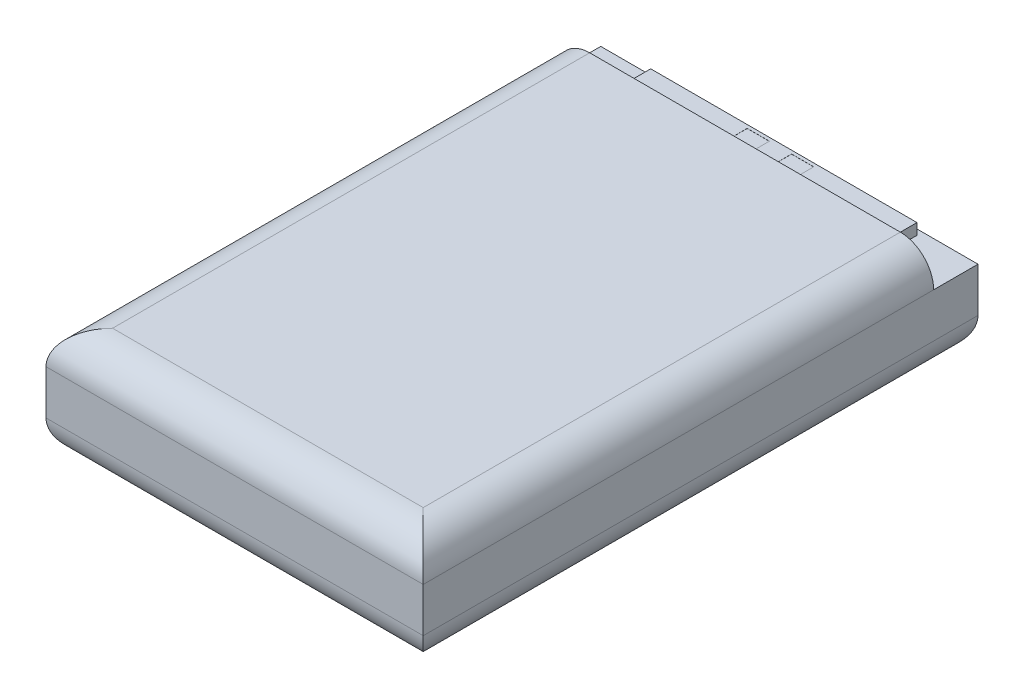
ISO-10303-21;
HEADER;
FILE_DESCRIPTION(('STEP AP214'),'2;1');
FILE_NAME('part.step','',(''),(''),'','','');
FILE_SCHEMA(('AUTOMOTIVE_DESIGN { 1 0 10303 214 1 1 1 1 }'));
ENDSEC;
DATA;
#1=APPLICATION_CONTEXT('core data for automotive mechanical design processes');
#2=APPLICATION_PROTOCOL_DEFINITION('international standard','automotive_design',2000,#1);
#3=PRODUCT_CONTEXT('',#1,'mechanical');
#4=PRODUCT('Part','Part','',(#3));
#5=PRODUCT_RELATED_PRODUCT_CATEGORY('part','',(#4));
#6=PRODUCT_DEFINITION_FORMATION('','',#4);
#7=PRODUCT_DEFINITION_CONTEXT('part definition',#1,'design');
#8=PRODUCT_DEFINITION('design','',#6,#7);
#9=PRODUCT_DEFINITION_SHAPE('','',#8);
#10=(LENGTH_UNIT() NAMED_UNIT(*) SI_UNIT(.MILLI.,.METRE.));
#11=(NAMED_UNIT(*) PLANE_ANGLE_UNIT() SI_UNIT($,.RADIAN.));
#12=(NAMED_UNIT(*) SI_UNIT($,.STERADIAN.) SOLID_ANGLE_UNIT());
#13=UNCERTAINTY_MEASURE_WITH_UNIT(LENGTH_MEASURE(1.E-05),#10,'distance_accuracy_value','');
#14=(GEOMETRIC_REPRESENTATION_CONTEXT(3) GLOBAL_UNCERTAINTY_ASSIGNED_CONTEXT((#13)) GLOBAL_UNIT_ASSIGNED_CONTEXT((#10,
#11,#12)) REPRESENTATION_CONTEXT('',''));
#15=CARTESIAN_POINT('',(0.,0.,0.));
#16=DIRECTION('',(0.,0.,1.));
#17=DIRECTION('',(1.,0.,0.));
#18=AXIS2_PLACEMENT_3D('',#15,#16,#17);
#19=CARTESIAN_POINT('',(0.,7.,0.));
#20=DIRECTION('',(0.,1.,0.));
#21=DIRECTION('',(0.,0.,1.));
#22=AXIS2_PLACEMENT_3D('',#19,#20,#21);
#23=PLANE('',#22);
#24=DIRECTION('',(1.,0.,0.));
#25=VECTOR('',#24,1.);
#26=CARTESIAN_POINT('',(-18.,7.,-21.));
#27=LINE('',#26,#25);
#28=CARTESIAN_POINT('',(-17.,7.,-21.));
#29=VERTEX_POINT('',#28);
#30=CARTESIAN_POINT('',(-12.,7.,-21.));
#31=VERTEX_POINT('',#30);
#32=EDGE_CURVE('E275',#29,#31,#27,.T.);
#33=ORIENTED_EDGE('',*,*,#32,.T.);
#34=DIRECTION('',(0.,0.,1.));
#35=VECTOR('',#34,1.);
#36=CARTESIAN_POINT('',(-12.,7.,-24.5));
#37=LINE('',#36,#35);
#38=CARTESIAN_POINT('',(-12.,7.,-24.5));
#39=VERTEX_POINT('',#38);
#40=EDGE_CURVE('E216',#39,#31,#37,.T.);
#41=ORIENTED_EDGE('',*,*,#40,.F.);
#42=DIRECTION('',(-1.,0.,0.));
#43=VECTOR('',#42,1.);
#44=CARTESIAN_POINT('',(-12.,7.,-24.5));
#45=LINE('',#44,#43);
#46=CARTESIAN_POINT('',(12.,7.,-24.5));
#47=VERTEX_POINT('',#46);
#48=EDGE_CURVE('E253',#47,#39,#45,.T.);
#49=ORIENTED_EDGE('',*,*,#48,.F.);
#50=DIRECTION('',(0.,0.,-1.));
#51=VECTOR('',#50,1.);
#52=CARTESIAN_POINT('',(12.,7.,-24.5));
#53=LINE('',#52,#51);
#54=CARTESIAN_POINT('',(12.,7.,-21.));
#55=VERTEX_POINT('',#54);
#56=EDGE_CURVE('E261',#55,#47,#53,.T.);
#57=ORIENTED_EDGE('',*,*,#56,.F.);
#58=CARTESIAN_POINT('',(17.,7.,-21.));
#59=VERTEX_POINT('',#58);
#60=EDGE_CURVE('E279',#55,#59,#27,.T.);
#61=ORIENTED_EDGE('',*,*,#60,.T.);
#62=DIRECTION('',(0.,0.,-1.));
#63=VECTOR('',#62,1.);
#64=CARTESIAN_POINT('',(17.,7.,25.));
#65=LINE('',#64,#63);
#66=CARTESIAN_POINT('',(17.,7.,-25.));
#67=VERTEX_POINT('',#66);
#68=EDGE_CURVE('E325',#67,#59,#65,.F.);
#69=ORIENTED_EDGE('',*,*,#68,.F.);
#70=DIRECTION('',(-1.,0.,0.));
#71=VECTOR('',#70,1.);
#72=CARTESIAN_POINT('',(17.,7.,-25.));
#73=LINE('',#72,#71);
#74=CARTESIAN_POINT('',(-17.,7.,-25.));
#75=VERTEX_POINT('',#74);
#76=EDGE_CURVE('E278',#67,#75,#73,.T.);
#77=ORIENTED_EDGE('',*,*,#76,.T.);
#78=DIRECTION('',(0.,0.,1.));
#79=VECTOR('',#78,1.);
#80=CARTESIAN_POINT('',(-17.,7.,25.));
#81=LINE('',#80,#79);
#82=EDGE_CURVE('E282',#75,#29,#81,.T.);
#83=ORIENTED_EDGE('',*,*,#82,.T.);
#84=EDGE_LOOP('',(#33,#41,#49,#57,#61,#69,#77,#83));
#85=FACE_BOUND('',#84,.T.);
#86=ADVANCED_FACE('F37',(#85),#23,.T.);
#87=CARTESIAN_POINT('',(-18.,7.,-21.));
#88=DIRECTION('',(0.,0.,1.));
#89=DIRECTION('',(1.,0.,0.));
#90=AXIS2_PLACEMENT_3D('',#87,#88,#89);
#91=PLANE('',#90);
#92=DIRECTION('',(0.,-1.,0.));
#93=VECTOR('',#92,1.);
#94=CARTESIAN_POINT('',(-12.,8.,-21.));
#95=LINE('',#94,#93);
#96=CARTESIAN_POINT('',(-12.,8.,-21.));
#97=VERTEX_POINT('',#96);
#98=EDGE_CURVE('E271',#97,#31,#95,.T.);
#99=ORIENTED_EDGE('',*,*,#98,.T.);
#100=ORIENTED_EDGE('',*,*,#32,.F.);
#101=CARTESIAN_POINT('',(-14.,7.,-21.));
#102=DIRECTION('',(0.,0.,1.));
#103=DIRECTION('',(1.,0.,0.));
#104=AXIS2_PLACEMENT_3D('',#101,#102,#103);
#105=CIRCLE('',#104,3.);
#106=CARTESIAN_POINT('',(-14.,10.,-21.));
#107=VERTEX_POINT('',#106);
#108=EDGE_CURVE('E284',#29,#107,#105,.F.);
#109=ORIENTED_EDGE('',*,*,#108,.T.);
#110=DIRECTION('',(1.,0.,0.));
#111=VECTOR('',#110,1.);
#112=CARTESIAN_POINT('',(-18.,10.,-21.));
#113=LINE('',#112,#111);
#114=CARTESIAN_POINT('',(14.,10.,-21.));
#115=VERTEX_POINT('',#114);
#116=EDGE_CURVE('E274',#107,#115,#113,.T.);
#117=ORIENTED_EDGE('',*,*,#116,.T.);
#118=CARTESIAN_POINT('',(14.,7.,-21.));
#119=DIRECTION('',(0.,0.,1.));
#120=DIRECTION('',(1.,0.,0.));
#121=AXIS2_PLACEMENT_3D('',#118,#119,#120);
#122=CIRCLE('',#121,3.);
#123=EDGE_CURVE('E11',#115,#59,#122,.F.);
#124=ORIENTED_EDGE('',*,*,#123,.T.);
#125=ORIENTED_EDGE('',*,*,#60,.F.);
#126=DIRECTION('',(0.,-1.,0.));
#127=VECTOR('',#126,1.);
#128=CARTESIAN_POINT('',(12.,8.,-21.));
#129=LINE('',#128,#127);
#130=CARTESIAN_POINT('',(12.,8.,-21.));
#131=VERTEX_POINT('',#130);
#132=EDGE_CURVE('E269',#131,#55,#129,.T.);
#133=ORIENTED_EDGE('',*,*,#132,.F.);
#134=DIRECTION('',(1.,0.,0.));
#135=VECTOR('',#134,1.);
#136=CARTESIAN_POINT('',(-12.,8.,-21.));
#137=LINE('',#136,#135);
#138=EDGE_CURVE('E252',#97,#131,#137,.T.);
#139=ORIENTED_EDGE('',*,*,#138,.F.);
#140=EDGE_LOOP('',(#99,#100,#109,#117,#124,#125,#133,#139));
#141=FACE_BOUND('',#140,.T.);
#142=ADVANCED_FACE('F404',(#141),#91,.F.);
#143=CARTESIAN_POINT('',(17.,10.,-25.));
#144=DIRECTION('',(0.,0.,1.));
#145=DIRECTION('',(1.,0.,0.));
#146=AXIS2_PLACEMENT_3D('',#143,#144,#145);
#147=PLANE('',#146);
#148=ORIENTED_EDGE('',*,*,#76,.F.);
#149=DIRECTION('',(0.,-1.,0.));
#150=VECTOR('',#149,1.);
#151=CARTESIAN_POINT('',(17.,10.,-25.));
#152=LINE('',#151,#150);
#153=CARTESIAN_POINT('',(17.,3.,-25.));
#154=VERTEX_POINT('',#153);
#155=EDGE_CURVE('E290',#67,#154,#152,.T.);
#156=ORIENTED_EDGE('',*,*,#155,.T.);
#157=DIRECTION('',(-1.,0.,0.));
#158=VECTOR('',#157,1.);
#159=CARTESIAN_POINT('',(17.,3.,-25.));
#160=LINE('',#159,#158);
#161=CARTESIAN_POINT('',(-17.,3.,-25.));
#162=VERTEX_POINT('',#161);
#163=EDGE_CURVE('E300',#154,#162,#160,.T.);
#164=ORIENTED_EDGE('',*,*,#163,.T.);
#165=DIRECTION('',(0.,-1.,0.));
#166=VECTOR('',#165,1.);
#167=CARTESIAN_POINT('',(-17.,10.,-25.));
#168=LINE('',#167,#166);
#169=EDGE_CURVE('E287',#75,#162,#168,.T.);
#170=ORIENTED_EDGE('',*,*,#169,.F.);
#171=EDGE_LOOP('',(#148,#156,#164,#170));
#172=FACE_BOUND('',#171,.T.);
#173=ADVANCED_FACE('F390',(#172),#147,.F.);
#174=CARTESIAN_POINT('',(-17.,10.,25.));
#175=DIRECTION('',(1.,0.,0.));
#176=DIRECTION('',(0.,0.,-1.));
#177=AXIS2_PLACEMENT_3D('',#174,#175,#176);
#178=PLANE('',#177);
#179=ORIENTED_EDGE('',*,*,#169,.T.);
#180=DIRECTION('',(0.,0.,1.));
#181=VECTOR('',#180,1.);
#182=CARTESIAN_POINT('',(-17.,3.,25.));
#183=LINE('',#182,#181);
#184=CARTESIAN_POINT('',(-17.,3.,25.));
#185=VERTEX_POINT('',#184);
#186=EDGE_CURVE('E45',#162,#185,#183,.T.);
#187=ORIENTED_EDGE('',*,*,#186,.T.);
#188=DIRECTION('',(0.,-1.,0.));
#189=VECTOR('',#188,1.);
#190=CARTESIAN_POINT('',(-17.,10.,25.));
#191=LINE('',#190,#189);
#192=CARTESIAN_POINT('',(-17.,7.,25.));
#193=VERTEX_POINT('',#192);
#194=EDGE_CURVE('E297',#193,#185,#191,.T.);
#195=ORIENTED_EDGE('',*,*,#194,.F.);
#196=DIRECTION('',(0.,0.,1.));
#197=VECTOR('',#196,1.);
#198=CARTESIAN_POINT('',(-17.,7.,-25.));
#199=LINE('',#198,#197);
#200=EDGE_CURVE('E330',#193,#29,#199,.F.);
#201=ORIENTED_EDGE('',*,*,#200,.T.);
#202=ORIENTED_EDGE('',*,*,#82,.F.);
#203=EDGE_LOOP('',(#179,#187,#195,#201,#202));
#204=FACE_BOUND('',#203,.T.);
#205=ADVANCED_FACE('F358',(#204),#178,.F.);
#206=CARTESIAN_POINT('',(17.,10.,25.));
#207=DIRECTION('',(0.,0.,-1.));
#208=DIRECTION('',(-1.,0.,0.));
#209=AXIS2_PLACEMENT_3D('',#206,#207,#208);
#210=PLANE('',#209);
#211=ORIENTED_EDGE('',*,*,#194,.T.);
#212=DIRECTION('',(1.,0.,0.));
#213=VECTOR('',#212,1.);
#214=CARTESIAN_POINT('',(17.,3.,25.));
#215=LINE('',#214,#213);
#216=CARTESIAN_POINT('',(17.,3.,25.));
#217=VERTEX_POINT('',#216);
#218=EDGE_CURVE('E314',#185,#217,#215,.T.);
#219=ORIENTED_EDGE('',*,*,#218,.T.);
#220=DIRECTION('',(0.,-1.,0.));
#221=VECTOR('',#220,1.);
#222=CARTESIAN_POINT('',(17.,10.,25.));
#223=LINE('',#222,#221);
#224=CARTESIAN_POINT('',(17.,7.,25.));
#225=VERTEX_POINT('',#224);
#226=EDGE_CURVE('E294',#225,#217,#223,.T.);
#227=ORIENTED_EDGE('',*,*,#226,.F.);
#228=DIRECTION('',(1.,0.,0.));
#229=VECTOR('',#228,1.);
#230=CARTESIAN_POINT('',(-17.,7.,25.));
#231=LINE('',#230,#229);
#232=EDGE_CURVE('E312',#225,#193,#231,.F.);
#233=ORIENTED_EDGE('',*,*,#232,.T.);
#234=EDGE_LOOP('',(#211,#219,#227,#233));
#235=FACE_BOUND('',#234,.T.);
#236=ADVANCED_FACE('F363',(#235),#210,.F.);
#237=CARTESIAN_POINT('',(17.,10.,25.));
#238=DIRECTION('',(-1.,0.,0.));
#239=DIRECTION('',(0.,0.,1.));
#240=AXIS2_PLACEMENT_3D('',#237,#238,#239);
#241=PLANE('',#240);
#242=ORIENTED_EDGE('',*,*,#226,.T.);
#243=DIRECTION('',(0.,0.,-1.));
#244=VECTOR('',#243,1.);
#245=CARTESIAN_POINT('',(17.,3.,25.));
#246=LINE('',#245,#244);
#247=EDGE_CURVE('E328',#217,#154,#246,.T.);
#248=ORIENTED_EDGE('',*,*,#247,.T.);
#249=ORIENTED_EDGE('',*,*,#155,.F.);
#250=ORIENTED_EDGE('',*,*,#68,.T.);
#251=EDGE_CURVE('E324',#59,#225,#65,.F.);
#252=ORIENTED_EDGE('',*,*,#251,.T.);
#253=EDGE_LOOP('',(#242,#248,#249,#250,#252));
#254=FACE_BOUND('',#253,.T.);
#255=ADVANCED_FACE('F387',(#254),#241,.F.);
#256=CARTESIAN_POINT('',(0.,10.,0.));
#257=DIRECTION('',(0.,1.,0.));
#258=DIRECTION('',(0.,0.,1.));
#259=AXIS2_PLACEMENT_3D('',#256,#257,#258);
#260=PLANE('',#259);
#261=ORIENTED_EDGE('',*,*,#116,.F.);
#262=DIRECTION('',(0.,0.,1.));
#263=VECTOR('',#262,1.);
#264=CARTESIAN_POINT('',(-14.,10.,25.));
#265=LINE('',#264,#263);
#266=CARTESIAN_POINT('',(-14.,10.,22.));
#267=VERTEX_POINT('',#266);
#268=EDGE_CURVE('E316',#107,#267,#265,.T.);
#269=ORIENTED_EDGE('',*,*,#268,.T.);
#270=DIRECTION('',(1.,0.,0.));
#271=VECTOR('',#270,1.);
#272=CARTESIAN_POINT('',(17.,10.,22.));
#273=LINE('',#272,#271);
#274=CARTESIAN_POINT('',(14.,10.,22.));
#275=VERTEX_POINT('',#274);
#276=EDGE_CURVE('E318',#267,#275,#273,.T.);
#277=ORIENTED_EDGE('',*,*,#276,.T.);
#278=DIRECTION('',(0.,0.,-1.));
#279=VECTOR('',#278,1.);
#280=CARTESIAN_POINT('',(14.,10.,-25.));
#281=LINE('',#280,#279);
#282=EDGE_CURVE('E321',#275,#115,#281,.T.);
#283=ORIENTED_EDGE('',*,*,#282,.T.);
#284=EDGE_LOOP('',(#261,#269,#277,#283));
#285=FACE_BOUND('',#284,.T.);
#286=ADVANCED_FACE('F402',(#285),#260,.T.);
#287=CARTESIAN_POINT('',(0.,0.,0.));
#288=DIRECTION('',(0.,1.,0.));
#289=DIRECTION('',(0.,0.,1.));
#290=AXIS2_PLACEMENT_3D('',#287,#288,#289);
#291=PLANE('',#290);
#292=DIRECTION('',(-1.,0.,0.));
#293=VECTOR('',#292,1.);
#294=CARTESIAN_POINT('',(0.,0.,-22.));
#295=LINE('',#294,#293);
#296=CARTESIAN_POINT('',(-14.,0.,-22.));
#297=VERTEX_POINT('',#296);
#298=CARTESIAN_POINT('',(14.,0.,-22.));
#299=VERTEX_POINT('',#298);
#300=EDGE_CURVE('E307',#297,#299,#295,.F.);
#301=ORIENTED_EDGE('',*,*,#300,.T.);
#302=DIRECTION('',(0.,0.,-1.));
#303=VECTOR('',#302,1.);
#304=CARTESIAN_POINT('',(14.,0.,0.));
#305=LINE('',#304,#303);
#306=CARTESIAN_POINT('',(14.,0.,22.));
#307=VERTEX_POINT('',#306);
#308=EDGE_CURVE('E310',#299,#307,#305,.F.);
#309=ORIENTED_EDGE('',*,*,#308,.T.);
#310=DIRECTION('',(1.,0.,0.));
#311=VECTOR('',#310,1.);
#312=CARTESIAN_POINT('',(0.,0.,22.));
#313=LINE('',#312,#311);
#314=CARTESIAN_POINT('',(-14.,0.,22.));
#315=VERTEX_POINT('',#314);
#316=EDGE_CURVE('E305',#307,#315,#313,.F.);
#317=ORIENTED_EDGE('',*,*,#316,.T.);
#318=DIRECTION('',(0.,0.,1.));
#319=VECTOR('',#318,1.);
#320=CARTESIAN_POINT('',(-14.,0.,0.));
#321=LINE('',#320,#319);
#322=EDGE_CURVE('E303',#315,#297,#321,.F.);
#323=ORIENTED_EDGE('',*,*,#322,.T.);
#324=EDGE_LOOP('',(#301,#309,#317,#323));
#325=FACE_BOUND('',#324,.T.);
#326=ADVANCED_FACE('F377',(#325),#291,.F.);
#327=CARTESIAN_POINT('',(17.,3.,22.));
#328=DIRECTION('',(1.,0.,0.));
#329=DIRECTION('',(0.,0.,-1.));
#330=AXIS2_PLACEMENT_3D('',#327,#328,#329);
#331=CYLINDRICAL_SURFACE('',#330,3.);
#332=CARTESIAN_POINT('',(-14.,3.,22.));
#333=DIRECTION('',(0.707106781186548,0.,0.707106781186547));
#334=DIRECTION('',(-0.707106781186547,0.,0.707106781186547));
#335=AXIS2_PLACEMENT_3D('',#332,#333,#334);
#336=ELLIPSE('',#335,4.24264068711929,3.);
#337=EDGE_CURVE('E339',#315,#185,#336,.F.);
#338=ORIENTED_EDGE('',*,*,#337,.F.);
#339=ORIENTED_EDGE('',*,*,#316,.F.);
#340=CARTESIAN_POINT('',(14.,3.,22.));
#341=DIRECTION('',(0.707106781186547,0.,-0.707106781186547));
#342=DIRECTION('',(-0.707106781186548,0.,-0.707106781186547));
#343=AXIS2_PLACEMENT_3D('',#340,#341,#342);
#344=ELLIPSE('',#343,4.24264068711928,3.);
#345=EDGE_CURVE('E291',#217,#307,#344,.T.);
#346=ORIENTED_EDGE('',*,*,#345,.F.);
#347=ORIENTED_EDGE('',*,*,#218,.F.);
#348=EDGE_LOOP('',(#338,#339,#346,#347));
#349=FACE_BOUND('',#348,.T.);
#350=ADVANCED_FACE('F368',(#349),#331,.T.);
#351=CARTESIAN_POINT('',(14.,3.,25.));
#352=DIRECTION('',(0.,0.,-1.));
#353=DIRECTION('',(-1.,0.,0.));
#354=AXIS2_PLACEMENT_3D('',#351,#352,#353);
#355=CYLINDRICAL_SURFACE('',#354,3.);
#356=ORIENTED_EDGE('',*,*,#345,.T.);
#357=ORIENTED_EDGE('',*,*,#308,.F.);
#358=CARTESIAN_POINT('',(14.,3.,-22.));
#359=DIRECTION('',(-0.707106781186548,0.,-0.707106781186547));
#360=DIRECTION('',(0.707106781186547,0.,-0.707106781186548));
#361=AXIS2_PLACEMENT_3D('',#358,#359,#360);
#362=ELLIPSE('',#361,4.24264068711929,3.);
#363=EDGE_CURVE('E336',#154,#299,#362,.T.);
#364=ORIENTED_EDGE('',*,*,#363,.F.);
#365=ORIENTED_EDGE('',*,*,#247,.F.);
#366=EDGE_LOOP('',(#356,#357,#364,#365));
#367=FACE_BOUND('',#366,.T.);
#368=ADVANCED_FACE('F384',(#367),#355,.T.);
#369=CARTESIAN_POINT('',(-14.,3.,25.));
#370=DIRECTION('',(0.,0.,1.));
#371=DIRECTION('',(1.,0.,0.));
#372=AXIS2_PLACEMENT_3D('',#369,#370,#371);
#373=CYLINDRICAL_SURFACE('',#372,3.);
#374=ORIENTED_EDGE('',*,*,#337,.T.);
#375=ORIENTED_EDGE('',*,*,#186,.F.);
#376=CARTESIAN_POINT('',(-14.,3.,-22.));
#377=DIRECTION('',(-0.707106781186547,0.,0.707106781186548));
#378=DIRECTION('',(0.707106781186548,0.,0.707106781186547));
#379=AXIS2_PLACEMENT_3D('',#376,#377,#378);
#380=ELLIPSE('',#379,4.24264068711928,3.);
#381=EDGE_CURVE('E334',#297,#162,#380,.F.);
#382=ORIENTED_EDGE('',*,*,#381,.F.);
#383=ORIENTED_EDGE('',*,*,#322,.F.);
#384=EDGE_LOOP('',(#374,#375,#382,#383));
#385=FACE_BOUND('',#384,.T.);
#386=ADVANCED_FACE('F373',(#385),#373,.T.);
#387=CARTESIAN_POINT('',(17.,3.,-22.));
#388=DIRECTION('',(-1.,0.,0.));
#389=DIRECTION('',(0.,0.,1.));
#390=AXIS2_PLACEMENT_3D('',#387,#388,#389);
#391=CYLINDRICAL_SURFACE('',#390,3.);
#392=ORIENTED_EDGE('',*,*,#363,.T.);
#393=ORIENTED_EDGE('',*,*,#300,.F.);
#394=ORIENTED_EDGE('',*,*,#381,.T.);
#395=ORIENTED_EDGE('',*,*,#163,.F.);
#396=EDGE_LOOP('',(#392,#393,#394,#395));
#397=FACE_BOUND('',#396,.T.);
#398=ADVANCED_FACE('F379',(#397),#391,.T.);
#399=CARTESIAN_POINT('',(-14.,7.,0.));
#400=DIRECTION('',(0.,0.,-1.));
#401=DIRECTION('',(-1.,0.,0.));
#402=AXIS2_PLACEMENT_3D('',#399,#400,#401);
#403=CYLINDRICAL_SURFACE('',#402,3.);
#404=ORIENTED_EDGE('',*,*,#108,.F.);
#405=ORIENTED_EDGE('',*,*,#200,.F.);
#406=CARTESIAN_POINT('',(-14.,7.,22.));
#407=DIRECTION('',(-0.707106781186548,0.,-0.707106781186547));
#408=DIRECTION('',(0.707106781186547,0.,-0.707106781186547));
#409=AXIS2_PLACEMENT_3D('',#406,#407,#408);
#410=ELLIPSE('',#409,4.24264068711929,3.);
#411=EDGE_CURVE('E337',#267,#193,#410,.F.);
#412=ORIENTED_EDGE('',*,*,#411,.F.);
#413=ORIENTED_EDGE('',*,*,#268,.F.);
#414=EDGE_LOOP('',(#404,#405,#412,#413));
#415=FACE_BOUND('',#414,.T.);
#416=ADVANCED_FACE('F39',(#415),#403,.T.);
#417=CARTESIAN_POINT('',(14.,7.,0.));
#418=DIRECTION('',(0.,0.,1.));
#419=DIRECTION('',(1.,0.,0.));
#420=AXIS2_PLACEMENT_3D('',#417,#418,#419);
#421=CYLINDRICAL_SURFACE('',#420,3.);
#422=ORIENTED_EDGE('',*,*,#123,.F.);
#423=ORIENTED_EDGE('',*,*,#282,.F.);
#424=CARTESIAN_POINT('',(14.,7.,22.));
#425=DIRECTION('',(-0.707106781186547,0.,0.707106781186547));
#426=DIRECTION('',(0.707106781186548,0.,0.707106781186547));
#427=AXIS2_PLACEMENT_3D('',#424,#425,#426);
#428=ELLIPSE('',#427,4.24264068711928,3.);
#429=EDGE_CURVE('E286',#225,#275,#428,.T.);
#430=ORIENTED_EDGE('',*,*,#429,.F.);
#431=ORIENTED_EDGE('',*,*,#251,.F.);
#432=EDGE_LOOP('',(#422,#423,#430,#431));
#433=FACE_BOUND('',#432,.T.);
#434=ADVANCED_FACE('F398',(#433),#421,.T.);
#435=CARTESIAN_POINT('',(0.,7.,22.));
#436=DIRECTION('',(-1.,0.,0.));
#437=DIRECTION('',(0.,0.,1.));
#438=AXIS2_PLACEMENT_3D('',#435,#436,#437);
#439=CYLINDRICAL_SURFACE('',#438,3.);
#440=ORIENTED_EDGE('',*,*,#411,.T.);
#441=ORIENTED_EDGE('',*,*,#232,.F.);
#442=ORIENTED_EDGE('',*,*,#429,.T.);
#443=ORIENTED_EDGE('',*,*,#276,.F.);
#444=EDGE_LOOP('',(#440,#441,#442,#443));
#445=FACE_BOUND('',#444,.T.);
#446=ADVANCED_FACE('F349',(#445),#439,.T.);
#447=CARTESIAN_POINT('',(-12.,8.,-24.5));
#448=DIRECTION('',(1.,0.,0.));
#449=DIRECTION('',(0.,0.,-1.));
#450=AXIS2_PLACEMENT_3D('',#447,#448,#449);
#451=PLANE('',#450);
#452=ORIENTED_EDGE('',*,*,#40,.T.);
#453=ORIENTED_EDGE('',*,*,#98,.F.);
#454=DIRECTION('',(0.,0.,1.));
#455=VECTOR('',#454,1.);
#456=CARTESIAN_POINT('',(-12.,8.,-24.5));
#457=LINE('',#456,#455);
#458=CARTESIAN_POINT('',(-12.,8.,-24.5));
#459=VERTEX_POINT('',#458);
#460=EDGE_CURVE('E249',#459,#97,#457,.T.);
#461=ORIENTED_EDGE('',*,*,#460,.F.);
#462=DIRECTION('',(0.,-1.,0.));
#463=VECTOR('',#462,1.);
#464=CARTESIAN_POINT('',(-12.,8.,-24.5));
#465=LINE('',#464,#463);
#466=EDGE_CURVE('E259',#459,#39,#465,.T.);
#467=ORIENTED_EDGE('',*,*,#466,.T.);
#468=EDGE_LOOP('',(#452,#453,#461,#467));
#469=FACE_BOUND('',#468,.T.);
#470=ADVANCED_FACE('F409',(#469),#451,.F.);
#471=CARTESIAN_POINT('',(12.,8.,-24.5));
#472=DIRECTION('',(-1.,0.,0.));
#473=DIRECTION('',(0.,0.,1.));
#474=AXIS2_PLACEMENT_3D('',#471,#472,#473);
#475=PLANE('',#474);
#476=ORIENTED_EDGE('',*,*,#56,.T.);
#477=DIRECTION('',(0.,-1.,0.));
#478=VECTOR('',#477,1.);
#479=CARTESIAN_POINT('',(12.,8.,-24.5));
#480=LINE('',#479,#478);
#481=CARTESIAN_POINT('',(12.,8.,-24.5));
#482=VERTEX_POINT('',#481);
#483=EDGE_CURVE('E266',#482,#47,#480,.T.);
#484=ORIENTED_EDGE('',*,*,#483,.F.);
#485=DIRECTION('',(0.,0.,-1.));
#486=VECTOR('',#485,1.);
#487=CARTESIAN_POINT('',(12.,8.,-24.5));
#488=LINE('',#487,#486);
#489=EDGE_CURVE('E255',#131,#482,#488,.T.);
#490=ORIENTED_EDGE('',*,*,#489,.F.);
#491=ORIENTED_EDGE('',*,*,#132,.T.);
#492=EDGE_LOOP('',(#476,#484,#490,#491));
#493=FACE_BOUND('',#492,.T.);
#494=ADVANCED_FACE('F418',(#493),#475,.F.);
#495=CARTESIAN_POINT('',(-12.,8.,-24.5));
#496=DIRECTION('',(0.,0.,1.));
#497=DIRECTION('',(1.,0.,0.));
#498=AXIS2_PLACEMENT_3D('',#495,#496,#497);
#499=PLANE('',#498);
#500=ORIENTED_EDGE('',*,*,#48,.T.);
#501=ORIENTED_EDGE('',*,*,#466,.F.);
#502=DIRECTION('',(-1.,0.,0.));
#503=VECTOR('',#502,1.);
#504=CARTESIAN_POINT('',(-12.,8.,-24.5));
#505=LINE('',#504,#503);
#506=EDGE_CURVE('E257',#482,#459,#505,.T.);
#507=ORIENTED_EDGE('',*,*,#506,.F.);
#508=ORIENTED_EDGE('',*,*,#483,.T.);
#509=EDGE_LOOP('',(#500,#501,#507,#508));
#510=FACE_BOUND('',#509,.T.);
#511=ADVANCED_FACE('F414',(#510),#499,.F.);
#512=CARTESIAN_POINT('',(0.,8.,0.));
#513=DIRECTION('',(0.,1.,0.));
#514=DIRECTION('',(0.,0.,1.));
#515=AXIS2_PLACEMENT_3D('',#512,#513,#514);
#516=PLANE('',#515);
#517=DIRECTION('',(0.,0.,1.));
#518=VECTOR('',#517,1.);
#519=CARTESIAN_POINT('',(-3.,8.,-24.2));
#520=LINE('',#519,#518);
#521=CARTESIAN_POINT('',(-3.,8.,-24.2));
#522=VERTEX_POINT('',#521);
#523=CARTESIAN_POINT('',(-3.,8.,-21.3));
#524=VERTEX_POINT('',#523);
#525=EDGE_CURVE('E52',#522,#524,#520,.T.);
#526=ORIENTED_EDGE('',*,*,#525,.F.);
#527=DIRECTION('',(-1.,0.,0.));
#528=VECTOR('',#527,1.);
#529=CARTESIAN_POINT('',(-3.,8.,-24.2));
#530=LINE('',#529,#528);
#531=CARTESIAN_POINT('',(-1.,8.,-24.2));
#532=VERTEX_POINT('',#531);
#533=EDGE_CURVE('E200',#532,#522,#530,.T.);
#534=ORIENTED_EDGE('',*,*,#533,.F.);
#535=DIRECTION('',(0.,0.,-1.));
#536=VECTOR('',#535,1.);
#537=CARTESIAN_POINT('',(-1.,8.,-24.2));
#538=LINE('',#537,#536);
#539=CARTESIAN_POINT('',(-1.,8.,-21.3));
#540=VERTEX_POINT('',#539);
#541=EDGE_CURVE('E203',#540,#532,#538,.T.);
#542=ORIENTED_EDGE('',*,*,#541,.F.);
#543=DIRECTION('',(1.,0.,0.));
#544=VECTOR('',#543,1.);
#545=CARTESIAN_POINT('',(-3.,8.,-21.3));
#546=LINE('',#545,#544);
#547=EDGE_CURVE('E209',#524,#540,#546,.T.);
#548=ORIENTED_EDGE('',*,*,#547,.F.);
#549=EDGE_LOOP('',(#526,#534,#542,#548));
#550=FACE_BOUND('',#549,.T.);
#551=DIRECTION('',(0.,0.,1.));
#552=VECTOR('',#551,1.);
#553=CARTESIAN_POINT('',(0.999999999999997,8.,-24.2));
#554=LINE('',#553,#552);
#555=CARTESIAN_POINT('',(0.999999999999997,8.,-24.2));
#556=VERTEX_POINT('',#555);
#557=CARTESIAN_POINT('',(0.999999999999997,8.,-21.3));
#558=VERTEX_POINT('',#557);
#559=EDGE_CURVE('E60',#556,#558,#554,.T.);
#560=ORIENTED_EDGE('',*,*,#559,.F.);
#561=DIRECTION('',(-1.,0.,0.));
#562=VECTOR('',#561,1.);
#563=CARTESIAN_POINT('',(0.999999999999997,8.,-24.2));
#564=LINE('',#563,#562);
#565=CARTESIAN_POINT('',(3.,8.,-24.2));
#566=VERTEX_POINT('',#565);
#567=EDGE_CURVE('E224',#566,#556,#564,.T.);
#568=ORIENTED_EDGE('',*,*,#567,.F.);
#569=DIRECTION('',(0.,0.,-1.));
#570=VECTOR('',#569,1.);
#571=CARTESIAN_POINT('',(3.,8.,-24.2));
#572=LINE('',#571,#570);
#573=CARTESIAN_POINT('',(3.,8.,-21.3));
#574=VERTEX_POINT('',#573);
#575=EDGE_CURVE('E238',#574,#566,#572,.T.);
#576=ORIENTED_EDGE('',*,*,#575,.F.);
#577=DIRECTION('',(1.,0.,0.));
#578=VECTOR('',#577,1.);
#579=CARTESIAN_POINT('',(0.999999999999997,8.,-21.3));
#580=LINE('',#579,#578);
#581=EDGE_CURVE('E235',#558,#574,#580,.T.);
#582=ORIENTED_EDGE('',*,*,#581,.F.);
#583=EDGE_LOOP('',(#560,#568,#576,#582));
#584=FACE_BOUND('',#583,.T.);
#585=ORIENTED_EDGE('',*,*,#460,.T.);
#586=ORIENTED_EDGE('',*,*,#138,.T.);
#587=ORIENTED_EDGE('',*,*,#489,.T.);
#588=ORIENTED_EDGE('',*,*,#506,.T.);
#589=EDGE_LOOP('',(#585,#586,#587,#588));
#590=FACE_BOUND('',#589,.T.);
#591=ADVANCED_FACE('F421',(#550,#584,#590),#516,.T.);
#592=CARTESIAN_POINT('',(0.999999999999997,7.99,-24.2));
#593=DIRECTION('',(-1.,0.,0.));
#594=DIRECTION('',(0.,0.,1.));
#595=AXIS2_PLACEMENT_3D('',#592,#593,#594);
#596=PLANE('',#595);
#597=ORIENTED_EDGE('',*,*,#559,.T.);
#598=DIRECTION('',(0.,1.,0.));
#599=VECTOR('',#598,1.);
#600=CARTESIAN_POINT('',(0.999999999999997,7.99,-21.3));
#601=LINE('',#600,#599);
#602=CARTESIAN_POINT('',(0.999999999999997,7.99,-21.3));
#603=VERTEX_POINT('',#602);
#604=EDGE_CURVE('E233',#603,#558,#601,.T.);
#605=ORIENTED_EDGE('',*,*,#604,.F.);
#606=DIRECTION('',(0.,0.,1.));
#607=VECTOR('',#606,1.);
#608=CARTESIAN_POINT('',(0.999999999999997,7.99,-24.2));
#609=LINE('',#608,#607);
#610=CARTESIAN_POINT('',(0.999999999999997,7.99,-24.2));
#611=VERTEX_POINT('',#610);
#612=EDGE_CURVE('E220',#611,#603,#609,.T.);
#613=ORIENTED_EDGE('',*,*,#612,.F.);
#614=DIRECTION('',(0.,1.,0.));
#615=VECTOR('',#614,1.);
#616=CARTESIAN_POINT('',(0.999999999999997,7.99,-24.2));
#617=LINE('',#616,#615);
#618=EDGE_CURVE('E210',#611,#556,#617,.T.);
#619=ORIENTED_EDGE('',*,*,#618,.T.);
#620=EDGE_LOOP('',(#597,#605,#613,#619));
#621=FACE_BOUND('',#620,.T.);
#622=ADVANCED_FACE('F423',(#621),#596,.F.);
#623=CARTESIAN_POINT('',(0.999999999999997,7.99,-24.2));
#624=DIRECTION('',(0.,0.,-1.));
#625=DIRECTION('',(-1.,0.,0.));
#626=AXIS2_PLACEMENT_3D('',#623,#624,#625);
#627=PLANE('',#626);
#628=ORIENTED_EDGE('',*,*,#567,.T.);
#629=ORIENTED_EDGE('',*,*,#618,.F.);
#630=DIRECTION('',(-1.,0.,0.));
#631=VECTOR('',#630,1.);
#632=CARTESIAN_POINT('',(0.999999999999997,7.99,-24.2));
#633=LINE('',#632,#631);
#634=CARTESIAN_POINT('',(3.,7.99,-24.2));
#635=VERTEX_POINT('',#634);
#636=EDGE_CURVE('E230',#635,#611,#633,.T.);
#637=ORIENTED_EDGE('',*,*,#636,.F.);
#638=DIRECTION('',(0.,1.,0.));
#639=VECTOR('',#638,1.);
#640=CARTESIAN_POINT('',(3.,7.99,-24.2));
#641=LINE('',#640,#639);
#642=EDGE_CURVE('E244',#635,#566,#641,.T.);
#643=ORIENTED_EDGE('',*,*,#642,.T.);
#644=EDGE_LOOP('',(#628,#629,#637,#643));
#645=FACE_BOUND('',#644,.T.);
#646=ADVANCED_FACE('F430',(#645),#627,.F.);
#647=CARTESIAN_POINT('',(3.,7.99,-24.2));
#648=DIRECTION('',(1.,0.,0.));
#649=DIRECTION('',(0.,0.,-1.));
#650=AXIS2_PLACEMENT_3D('',#647,#648,#649);
#651=PLANE('',#650);
#652=ORIENTED_EDGE('',*,*,#575,.T.);
#653=ORIENTED_EDGE('',*,*,#642,.F.);
#654=DIRECTION('',(0.,0.,-1.));
#655=VECTOR('',#654,1.);
#656=CARTESIAN_POINT('',(3.,7.99,-24.2));
#657=LINE('',#656,#655);
#658=CARTESIAN_POINT('',(3.,7.99,-21.3));
#659=VERTEX_POINT('',#658);
#660=EDGE_CURVE('E227',#659,#635,#657,.T.);
#661=ORIENTED_EDGE('',*,*,#660,.F.);
#662=DIRECTION('',(0.,1.,0.));
#663=VECTOR('',#662,1.);
#664=CARTESIAN_POINT('',(3.,7.99,-21.3));
#665=LINE('',#664,#663);
#666=EDGE_CURVE('E246',#659,#574,#665,.T.);
#667=ORIENTED_EDGE('',*,*,#666,.T.);
#668=EDGE_LOOP('',(#652,#653,#661,#667));
#669=FACE_BOUND('',#668,.T.);
#670=ADVANCED_FACE('F556',(#669),#651,.F.);
#671=CARTESIAN_POINT('',(0.999999999999997,7.99,-21.3));
#672=DIRECTION('',(0.,0.,1.));
#673=DIRECTION('',(1.,0.,0.));
#674=AXIS2_PLACEMENT_3D('',#671,#672,#673);
#675=PLANE('',#674);
#676=ORIENTED_EDGE('',*,*,#581,.T.);
#677=ORIENTED_EDGE('',*,*,#666,.F.);
#678=DIRECTION('',(1.,0.,0.));
#679=VECTOR('',#678,1.);
#680=CARTESIAN_POINT('',(0.999999999999997,7.99,-21.3));
#681=LINE('',#680,#679);
#682=EDGE_CURVE('E223',#603,#659,#681,.T.);
#683=ORIENTED_EDGE('',*,*,#682,.F.);
#684=ORIENTED_EDGE('',*,*,#604,.T.);
#685=EDGE_LOOP('',(#676,#677,#683,#684));
#686=FACE_BOUND('',#685,.T.);
#687=ADVANCED_FACE('F566',(#686),#675,.F.);
#688=CARTESIAN_POINT('',(0.,7.99,0.));
#689=DIRECTION('',(0.,1.,0.));
#690=DIRECTION('',(0.,0.,1.));
#691=AXIS2_PLACEMENT_3D('',#688,#689,#690);
#692=PLANE('',#691);
#693=ORIENTED_EDGE('',*,*,#612,.T.);
#694=ORIENTED_EDGE('',*,*,#682,.T.);
#695=ORIENTED_EDGE('',*,*,#660,.T.);
#696=ORIENTED_EDGE('',*,*,#636,.T.);
#697=EDGE_LOOP('',(#693,#694,#695,#696));
#698=FACE_BOUND('',#697,.T.);
#699=ADVANCED_FACE('F576',(#698),#692,.T.);
#700=CARTESIAN_POINT('',(-3.,7.99,-24.2));
#701=DIRECTION('',(-1.,0.,0.));
#702=DIRECTION('',(0.,0.,1.));
#703=AXIS2_PLACEMENT_3D('',#700,#701,#702);
#704=PLANE('',#703);
#705=ORIENTED_EDGE('',*,*,#525,.T.);
#706=DIRECTION('',(0.,1.,0.));
#707=VECTOR('',#706,1.);
#708=CARTESIAN_POINT('',(-3.,7.99,-21.3));
#709=LINE('',#708,#707);
#710=CARTESIAN_POINT('',(-3.,7.99,-21.3));
#711=VERTEX_POINT('',#710);
#712=EDGE_CURVE('E178',#711,#524,#709,.T.);
#713=ORIENTED_EDGE('',*,*,#712,.F.);
#714=DIRECTION('',(0.,0.,1.));
#715=VECTOR('',#714,1.);
#716=CARTESIAN_POINT('',(-3.,7.99,-24.2));
#717=LINE('',#716,#715);
#718=CARTESIAN_POINT('',(-3.,7.99,-24.2));
#719=VERTEX_POINT('',#718);
#720=EDGE_CURVE('E182',#719,#711,#717,.T.);
#721=ORIENTED_EDGE('',*,*,#720,.F.);
#722=DIRECTION('',(0.,1.,0.));
#723=VECTOR('',#722,1.);
#724=CARTESIAN_POINT('',(-3.,7.99,-24.2));
#725=LINE('',#724,#723);
#726=EDGE_CURVE('E214',#719,#522,#725,.T.);
#727=ORIENTED_EDGE('',*,*,#726,.T.);
#728=EDGE_LOOP('',(#705,#713,#721,#727));
#729=FACE_BOUND('',#728,.T.);
#730=ADVANCED_FACE('F180',(#729),#704,.F.);
#731=CARTESIAN_POINT('',(-3.,7.99,-24.2));
#732=DIRECTION('',(0.,0.,-1.));
#733=DIRECTION('',(-1.,0.,0.));
#734=AXIS2_PLACEMENT_3D('',#731,#732,#733);
#735=PLANE('',#734);
#736=ORIENTED_EDGE('',*,*,#533,.T.);
#737=ORIENTED_EDGE('',*,*,#726,.F.);
#738=DIRECTION('',(-1.,0.,0.));
#739=VECTOR('',#738,1.);
#740=CARTESIAN_POINT('',(-3.,7.99,-24.2));
#741=LINE('',#740,#739);
#742=CARTESIAN_POINT('',(-1.,7.99,-24.2));
#743=VERTEX_POINT('',#742);
#744=EDGE_CURVE('E188',#743,#719,#741,.T.);
#745=ORIENTED_EDGE('',*,*,#744,.F.);
#746=DIRECTION('',(0.,1.,0.));
#747=VECTOR('',#746,1.);
#748=CARTESIAN_POINT('',(-1.,7.99,-24.2));
#749=LINE('',#748,#747);
#750=EDGE_CURVE('E217',#743,#532,#749,.T.);
#751=ORIENTED_EDGE('',*,*,#750,.T.);
#752=EDGE_LOOP('',(#736,#737,#745,#751));
#753=FACE_BOUND('',#752,.T.);
#754=ADVANCED_FACE('F595',(#753),#735,.F.);
#755=CARTESIAN_POINT('',(-1.,7.99,-24.2));
#756=DIRECTION('',(1.,0.,0.));
#757=DIRECTION('',(0.,0.,-1.));
#758=AXIS2_PLACEMENT_3D('',#755,#756,#757);
#759=PLANE('',#758);
#760=ORIENTED_EDGE('',*,*,#541,.T.);
#761=ORIENTED_EDGE('',*,*,#750,.F.);
#762=DIRECTION('',(0.,0.,-1.));
#763=VECTOR('',#762,1.);
#764=CARTESIAN_POINT('',(-1.,7.99,-24.2));
#765=LINE('',#764,#763);
#766=CARTESIAN_POINT('',(-1.,7.99,-21.3));
#767=VERTEX_POINT('',#766);
#768=EDGE_CURVE('E196',#767,#743,#765,.T.);
#769=ORIENTED_EDGE('',*,*,#768,.F.);
#770=DIRECTION('',(0.,1.,0.));
#771=VECTOR('',#770,1.);
#772=CARTESIAN_POINT('',(-1.,7.99,-21.3));
#773=LINE('',#772,#771);
#774=EDGE_CURVE('E187',#767,#540,#773,.T.);
#775=ORIENTED_EDGE('',*,*,#774,.T.);
#776=EDGE_LOOP('',(#760,#761,#769,#775));
#777=FACE_BOUND('',#776,.T.);
#778=ADVANCED_FACE('F604',(#777),#759,.F.);
#779=CARTESIAN_POINT('',(-3.,7.99,-21.3));
#780=DIRECTION('',(0.,0.,1.));
#781=DIRECTION('',(1.,0.,0.));
#782=AXIS2_PLACEMENT_3D('',#779,#780,#781);
#783=PLANE('',#782);
#784=ORIENTED_EDGE('',*,*,#547,.T.);
#785=ORIENTED_EDGE('',*,*,#774,.F.);
#786=DIRECTION('',(1.,0.,0.));
#787=VECTOR('',#786,1.);
#788=CARTESIAN_POINT('',(-3.,7.99,-21.3));
#789=LINE('',#788,#787);
#790=EDGE_CURVE('E191',#711,#767,#789,.T.);
#791=ORIENTED_EDGE('',*,*,#790,.F.);
#792=ORIENTED_EDGE('',*,*,#712,.T.);
#793=EDGE_LOOP('',(#784,#785,#791,#792));
#794=FACE_BOUND('',#793,.T.);
#795=ADVANCED_FACE('F192',(#794),#783,.F.);
#796=CARTESIAN_POINT('',(0.,7.99,0.));
#797=DIRECTION('',(0.,1.,0.));
#798=DIRECTION('',(0.,0.,1.));
#799=AXIS2_PLACEMENT_3D('',#796,#797,#798);
#800=PLANE('',#799);
#801=ORIENTED_EDGE('',*,*,#720,.T.);
#802=ORIENTED_EDGE('',*,*,#790,.T.);
#803=ORIENTED_EDGE('',*,*,#768,.T.);
#804=ORIENTED_EDGE('',*,*,#744,.T.);
#805=EDGE_LOOP('',(#801,#802,#803,#804));
#806=FACE_BOUND('',#805,.T.);
#807=ADVANCED_FACE('F198',(#806),#800,.T.);
#808=CLOSED_SHELL('',(#86,#142,#173,#205,#236,#255,#286,#326,#350,#368,#386,#398,#416,#434,#446,
#470,#494,#511,#591,#622,#646,#670,#687,#699,#730,#754,#778,#795,#807));
#809=MANIFOLD_SOLID_BREP('B2',#808);
#810=ADVANCED_BREP_SHAPE_REPRESENTATION('',(#18,#809),#14);
#811=SHAPE_DEFINITION_REPRESENTATION(#9,#810);
ENDSEC;
END-ISO-10303-21;
